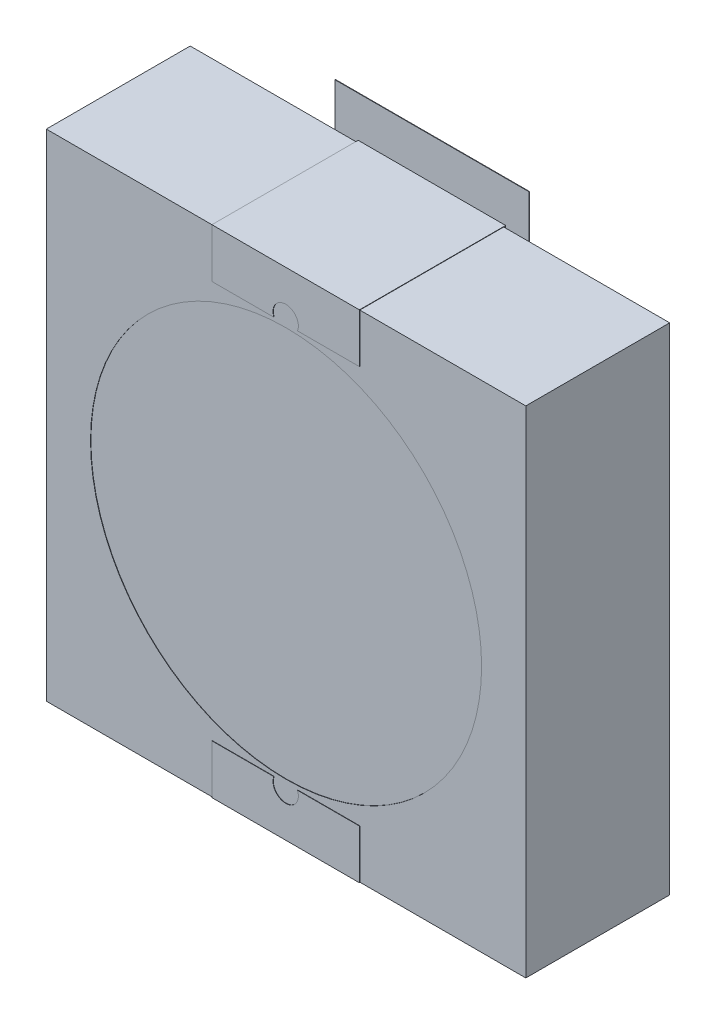
ISO-10303-21;
HEADER;
FILE_DESCRIPTION(('STEP AP214'),'2;1');
FILE_NAME('part.step','',(''),(''),'','','');
FILE_SCHEMA(('AUTOMOTIVE_DESIGN { 1 0 10303 214 1 1 1 1 }'));
ENDSEC;
DATA;
#1=APPLICATION_CONTEXT('core data for automotive mechanical design processes');
#2=APPLICATION_PROTOCOL_DEFINITION('international standard','automotive_design',2000,#1);
#3=PRODUCT_CONTEXT('',#1,'mechanical');
#4=PRODUCT('Part','Part','',(#3));
#5=PRODUCT_RELATED_PRODUCT_CATEGORY('part','',(#4));
#6=PRODUCT_DEFINITION_FORMATION('','',#4);
#7=PRODUCT_DEFINITION_CONTEXT('part definition',#1,'design');
#8=PRODUCT_DEFINITION('design','',#6,#7);
#9=PRODUCT_DEFINITION_SHAPE('','',#8);
#10=(LENGTH_UNIT() NAMED_UNIT(*) SI_UNIT(.MILLI.,.METRE.));
#11=(NAMED_UNIT(*) PLANE_ANGLE_UNIT() SI_UNIT($,.RADIAN.));
#12=(NAMED_UNIT(*) SI_UNIT($,.STERADIAN.) SOLID_ANGLE_UNIT());
#13=UNCERTAINTY_MEASURE_WITH_UNIT(LENGTH_MEASURE(1.E-05),#10,'distance_accuracy_value','');
#14=(GEOMETRIC_REPRESENTATION_CONTEXT(3) GLOBAL_UNCERTAINTY_ASSIGNED_CONTEXT((#13)) GLOBAL_UNIT_ASSIGNED_CONTEXT((#10,
#11,#12)) REPRESENTATION_CONTEXT('',''));
#15=CARTESIAN_POINT('',(0.,0.,0.));
#16=DIRECTION('',(0.,0.,1.));
#17=DIRECTION('',(1.,0.,0.));
#18=AXIS2_PLACEMENT_3D('',#15,#16,#17);
#19=CARTESIAN_POINT('',(-1.524,4.10972,0.0762));
#20=DIRECTION('',(0.,0.,-1.));
#21=DIRECTION('',(-1.,0.,0.));
#22=AXIS2_PLACEMENT_3D('',#19,#20,#21);
#23=PLANE('',#22);
#24=DIRECTION('',(1.,0.,0.));
#25=VECTOR('',#24,1.);
#26=CARTESIAN_POINT('',(2.0049998,-1.6500094,0.0762));
#27=LINE('',#26,#25);
#28=CARTESIAN_POINT('',(2.0049998,-1.6500094,0.0762));
#29=VERTEX_POINT('',#28);
#30=CARTESIAN_POINT('',(-2.0049998,-1.6500094,0.0762));
#31=VERTEX_POINT('',#30);
#32=EDGE_CURVE('E252',#29,#31,#27,.F.);
#33=ORIENTED_EDGE('',*,*,#32,.F.);
#34=DIRECTION('',(0.,1.,0.));
#35=VECTOR('',#34,1.);
#36=CARTESIAN_POINT('',(2.0049998,-5.9699906,0.0762));
#37=LINE('',#36,#35);
#38=CARTESIAN_POINT('',(2.0049998,-5.9699906,0.0762));
#39=VERTEX_POINT('',#38);
#40=EDGE_CURVE('E344',#39,#29,#37,.T.);
#41=ORIENTED_EDGE('',*,*,#40,.F.);
#42=DIRECTION('',(1.,0.,0.));
#43=VECTOR('',#42,1.);
#44=CARTESIAN_POINT('',(-2.0049998,-5.9699906,0.0762));
#45=LINE('',#44,#43);
#46=CARTESIAN_POINT('',(-2.0049998,-5.9699906,0.0762));
#47=VERTEX_POINT('',#46);
#48=EDGE_CURVE('E352',#47,#39,#45,.T.);
#49=ORIENTED_EDGE('',*,*,#48,.F.);
#50=DIRECTION('',(0.,1.,0.));
#51=VECTOR('',#50,1.);
#52=CARTESIAN_POINT('',(-2.0049998,-1.6500094,0.0762));
#53=LINE('',#52,#51);
#54=EDGE_CURVE('E357',#31,#47,#53,.F.);
#55=ORIENTED_EDGE('',*,*,#54,.F.);
#56=EDGE_LOOP('',(#33,#41,#49,#55));
#57=FACE_BOUND('',#56,.T.);
#58=ADVANCED_FACE('F16',(#57),#23,.T.);
#59=CARTESIAN_POINT('',(-1.524,4.10972,0.0762));
#60=DIRECTION('',(0.,0.,-1.));
#61=DIRECTION('',(-1.,0.,0.));
#62=AXIS2_PLACEMENT_3D('',#59,#60,#61);
#63=PLANE('',#62);
#64=DIRECTION('',(1.,0.,0.));
#65=VECTOR('',#64,1.);
#66=CARTESIAN_POINT('',(2.0049998,5.9699906,0.0762));
#67=LINE('',#66,#65);
#68=CARTESIAN_POINT('',(2.0049998,5.9699906,0.0762));
#69=VERTEX_POINT('',#68);
#70=CARTESIAN_POINT('',(-2.0049998,5.9699906,0.0762));
#71=VERTEX_POINT('',#70);
#72=EDGE_CURVE('E340',#69,#71,#67,.F.);
#73=ORIENTED_EDGE('',*,*,#72,.F.);
#74=DIRECTION('',(0.,1.,0.));
#75=VECTOR('',#74,1.);
#76=CARTESIAN_POINT('',(2.0049998,1.6500094,0.0762));
#77=LINE('',#76,#75);
#78=CARTESIAN_POINT('',(2.0049998,1.6500094,0.0762));
#79=VERTEX_POINT('',#78);
#80=EDGE_CURVE('E294',#79,#69,#77,.T.);
#81=ORIENTED_EDGE('',*,*,#80,.F.);
#82=DIRECTION('',(1.,0.,0.));
#83=VECTOR('',#82,1.);
#84=CARTESIAN_POINT('',(-2.0049998,1.6500094,0.0762));
#85=LINE('',#84,#83);
#86=CARTESIAN_POINT('',(-2.0049998,1.6500094,0.0762));
#87=VERTEX_POINT('',#86);
#88=EDGE_CURVE('E433',#87,#79,#85,.T.);
#89=ORIENTED_EDGE('',*,*,#88,.F.);
#90=DIRECTION('',(0.,1.,0.));
#91=VECTOR('',#90,1.);
#92=CARTESIAN_POINT('',(-2.0049998,5.9699906,0.0762));
#93=LINE('',#92,#91);
#94=EDGE_CURVE('E438',#71,#87,#93,.F.);
#95=ORIENTED_EDGE('',*,*,#94,.F.);
#96=EDGE_LOOP('',(#73,#81,#89,#95));
#97=FACE_BOUND('',#96,.T.);
#98=ADVANCED_FACE('F451',(#97),#63,.T.);
#99=CARTESIAN_POINT('',(-1.524,5.12572,3.10642));
#100=DIRECTION('',(0.,0.,1.));
#101=DIRECTION('',(1.,0.,0.));
#102=AXIS2_PLACEMENT_3D('',#99,#100,#101);
#103=PLANE('',#102);
#104=DIRECTION('',(1.,0.,0.));
#105=VECTOR('',#104,1.);
#106=CARTESIAN_POINT('',(-1.524,4.10972,3.10642));
#107=LINE('',#106,#105);
#108=CARTESIAN_POINT('',(-1.524,4.10972,3.10642));
#109=VERTEX_POINT('',#108);
#110=CARTESIAN_POINT('',(-0.244157293562977,4.10972,3.10642));
#111=VERTEX_POINT('',#110);
#112=EDGE_CURVE('E221',#109,#111,#107,.T.);
#113=ORIENTED_EDGE('',*,*,#112,.T.);
#114=CARTESIAN_POINT('',(0.,4.2037,3.10642));
#115=DIRECTION('',(0.,0.,1.));
#116=DIRECTION('',(1.,0.,0.));
#117=AXIS2_PLACEMENT_3D('',#114,#115,#116);
#118=CIRCLE('',#117,0.26162);
#119=CARTESIAN_POINT('',(0.244157293562981,4.10972,3.10642));
#120=VERTEX_POINT('',#119);
#121=EDGE_CURVE('E19',#111,#120,#118,.F.);
#122=ORIENTED_EDGE('',*,*,#121,.T.);
#123=DIRECTION('',(1.,0.,0.));
#124=VECTOR('',#123,1.);
#125=CARTESIAN_POINT('',(-1.524,4.10972,3.10642));
#126=LINE('',#125,#124);
#127=CARTESIAN_POINT('',(1.524,4.10972,3.10642));
#128=VERTEX_POINT('',#127);
#129=EDGE_CURVE('E264',#120,#128,#126,.T.);
#130=ORIENTED_EDGE('',*,*,#129,.T.);
#131=DIRECTION('',(0.,1.,0.));
#132=VECTOR('',#131,1.);
#133=CARTESIAN_POINT('',(1.524,5.12572,3.10642));
#134=LINE('',#133,#132);
#135=CARTESIAN_POINT('',(1.524,5.12572,3.10642));
#136=VERTEX_POINT('',#135);
#137=EDGE_CURVE('E266',#128,#136,#134,.T.);
#138=ORIENTED_EDGE('',*,*,#137,.T.);
#139=DIRECTION('',(1.,0.,0.));
#140=VECTOR('',#139,1.);
#141=CARTESIAN_POINT('',(-1.524,5.12572,3.10642));
#142=LINE('',#141,#140);
#143=CARTESIAN_POINT('',(-1.524,5.12572,3.10642));
#144=VERTEX_POINT('',#143);
#145=EDGE_CURVE('E291',#144,#136,#142,.T.);
#146=ORIENTED_EDGE('',*,*,#145,.F.);
#147=DIRECTION('',(0.,1.,0.));
#148=VECTOR('',#147,1.);
#149=CARTESIAN_POINT('',(-1.524,5.12572,3.10642));
#150=LINE('',#149,#148);
#151=EDGE_CURVE('E227',#144,#109,#150,.F.);
#152=ORIENTED_EDGE('',*,*,#151,.T.);
#153=EDGE_LOOP('',(#113,#122,#130,#138,#146,#152));
#154=FACE_BOUND('',#153,.T.);
#155=ADVANCED_FACE('F223',(#154),#103,.T.);
#156=CARTESIAN_POINT('',(0.,0.,3.09118));
#157=DIRECTION('',(0.,0.,1.));
#158=DIRECTION('',(1.,0.,0.));
#159=AXIS2_PLACEMENT_3D('',#156,#157,#158);
#160=PLANE('',#159);
#161=CARTESIAN_POINT('',(0.,0.,3.09118));
#162=DIRECTION('',(0.,0.,1.));
#163=DIRECTION('',(1.,0.,0.));
#164=AXIS2_PLACEMENT_3D('',#161,#162,#163);
#165=CIRCLE('',#164,4.0397019473008);
#166=CARTESIAN_POINT('',(4.0397019473008,0.,3.09118));
#167=VERTEX_POINT('',#166);
#168=EDGE_CURVE('E324',#167,#167,#165,.T.);
#169=ORIENTED_EDGE('',*,*,#168,.T.);
#170=EDGE_LOOP('',(#169));
#171=FACE_BOUND('',#170,.T.);
#172=ADVANCED_FACE('F733',(#171),#160,.T.);
#173=CARTESIAN_POINT('',(-1.524,-4.10972,3.10642));
#174=DIRECTION('',(0.,0.,1.));
#175=DIRECTION('',(1.,0.,0.));
#176=AXIS2_PLACEMENT_3D('',#173,#174,#175);
#177=PLANE('',#176);
#178=DIRECTION('',(1.,0.,0.));
#179=VECTOR('',#178,1.);
#180=CARTESIAN_POINT('',(-1.524,-4.10972,3.10642));
#181=LINE('',#180,#179);
#182=CARTESIAN_POINT('',(0.244157293562977,-4.10972,3.10642));
#183=VERTEX_POINT('',#182);
#184=CARTESIAN_POINT('',(1.524,-4.10972,3.10642));
#185=VERTEX_POINT('',#184);
#186=EDGE_CURVE('E329',#183,#185,#181,.T.);
#187=ORIENTED_EDGE('',*,*,#186,.F.);
#188=CARTESIAN_POINT('',(0.,-4.2037,3.10642));
#189=DIRECTION('',(0.,0.,1.));
#190=DIRECTION('',(1.,0.,0.));
#191=AXIS2_PLACEMENT_3D('',#188,#189,#190);
#192=CIRCLE('',#191,0.26162);
#193=CARTESIAN_POINT('',(-0.244157293562977,-4.10972,3.10642));
#194=VERTEX_POINT('',#193);
#195=EDGE_CURVE('E239',#183,#194,#192,.F.);
#196=ORIENTED_EDGE('',*,*,#195,.T.);
#197=DIRECTION('',(1.,0.,0.));
#198=VECTOR('',#197,1.);
#199=CARTESIAN_POINT('',(-1.524,-4.10972,3.10642));
#200=LINE('',#199,#198);
#201=CARTESIAN_POINT('',(-1.524,-4.10972,3.10642));
#202=VERTEX_POINT('',#201);
#203=EDGE_CURVE('E326',#202,#194,#200,.T.);
#204=ORIENTED_EDGE('',*,*,#203,.F.);
#205=DIRECTION('',(0.,1.,0.));
#206=VECTOR('',#205,1.);
#207=CARTESIAN_POINT('',(-1.524,-4.10972,3.10642));
#208=LINE('',#207,#206);
#209=CARTESIAN_POINT('',(-1.524,-5.12572,3.10642));
#210=VERTEX_POINT('',#209);
#211=EDGE_CURVE('E245',#202,#210,#208,.F.);
#212=ORIENTED_EDGE('',*,*,#211,.T.);
#213=DIRECTION('',(1.,0.,0.));
#214=VECTOR('',#213,1.);
#215=CARTESIAN_POINT('',(-1.524,-5.12572,3.10642));
#216=LINE('',#215,#214);
#217=CARTESIAN_POINT('',(1.524,-5.12572,3.10642));
#218=VERTEX_POINT('',#217);
#219=EDGE_CURVE('E269',#218,#210,#216,.F.);
#220=ORIENTED_EDGE('',*,*,#219,.F.);
#221=DIRECTION('',(0.,1.,0.));
#222=VECTOR('',#221,1.);
#223=CARTESIAN_POINT('',(1.524,-4.10972,3.10642));
#224=LINE('',#223,#222);
#225=EDGE_CURVE('E246',#218,#185,#224,.T.);
#226=ORIENTED_EDGE('',*,*,#225,.T.);
#227=EDGE_LOOP('',(#187,#196,#204,#212,#220,#226));
#228=FACE_BOUND('',#227,.T.);
#229=ADVANCED_FACE('F681',(#228),#177,.T.);
#230=CARTESIAN_POINT('',(2.0049998,-1.6500094,0.0762));
#231=DIRECTION('',(0.,1.,0.));
#232=DIRECTION('',(0.,0.,1.));
#233=AXIS2_PLACEMENT_3D('',#230,#231,#232);
#234=PLANE('',#233);
#235=DIRECTION('',(0.,0.,-1.));
#236=VECTOR('',#235,1.);
#237=CARTESIAN_POINT('',(2.0049998,-1.6500094,0.0762));
#238=LINE('',#237,#236);
#239=CARTESIAN_POINT('',(2.0049998,-1.6500094,0.08619999999996));
#240=VERTEX_POINT('',#239);
#241=EDGE_CURVE('E350',#29,#240,#238,.F.);
#242=ORIENTED_EDGE('',*,*,#241,.F.);
#243=ORIENTED_EDGE('',*,*,#32,.T.);
#244=DIRECTION('',(0.,0.,1.));
#245=VECTOR('',#244,1.);
#246=CARTESIAN_POINT('',(-2.0049998,-1.6500094,0.0762));
#247=LINE('',#246,#245);
#248=CARTESIAN_POINT('',(-2.0049998,-1.6500094,0.08619999999996));
#249=VERTEX_POINT('',#248);
#250=EDGE_CURVE('E359',#249,#31,#247,.F.);
#251=ORIENTED_EDGE('',*,*,#250,.F.);
#252=DIRECTION('',(1.,0.,0.));
#253=VECTOR('',#252,1.);
#254=CARTESIAN_POINT('',(0.,-1.6500094,0.08619999999996));
#255=LINE('',#254,#253);
#256=EDGE_CURVE('E271',#240,#249,#255,.F.);
#257=ORIENTED_EDGE('',*,*,#256,.F.);
#258=EDGE_LOOP('',(#242,#243,#251,#257));
#259=FACE_BOUND('',#258,.T.);
#260=ADVANCED_FACE('F726',(#259),#234,.T.);
#261=CARTESIAN_POINT('',(-2.0049998,-1.6500094,0.0762));
#262=DIRECTION('',(-1.,0.,0.));
#263=DIRECTION('',(0.,0.,1.));
#264=AXIS2_PLACEMENT_3D('',#261,#262,#263);
#265=PLANE('',#264);
#266=ORIENTED_EDGE('',*,*,#250,.T.);
#267=ORIENTED_EDGE('',*,*,#54,.T.);
#268=DIRECTION('',(0.,0.,-1.));
#269=VECTOR('',#268,1.);
#270=CARTESIAN_POINT('',(-2.0049998,-5.9699906,0.0762));
#271=LINE('',#270,#269);
#272=CARTESIAN_POINT('',(-2.0049998,-5.9699906,0.08619999999996));
#273=VERTEX_POINT('',#272);
#274=EDGE_CURVE('E354',#273,#47,#271,.T.);
#275=ORIENTED_EDGE('',*,*,#274,.F.);
#276=DIRECTION('',(0.,1.,0.));
#277=VECTOR('',#276,1.);
#278=CARTESIAN_POINT('',(-2.0049998,0.,0.08619999999996));
#279=LINE('',#278,#277);
#280=EDGE_CURVE('E485',#249,#273,#279,.F.);
#281=ORIENTED_EDGE('',*,*,#280,.F.);
#282=EDGE_LOOP('',(#266,#267,#275,#281));
#283=FACE_BOUND('',#282,.T.);
#284=ADVANCED_FACE('F722',(#283),#265,.T.);
#285=CARTESIAN_POINT('',(-2.0049998,-5.9699906,0.0762));
#286=DIRECTION('',(0.,-1.,0.));
#287=DIRECTION('',(0.,0.,-1.));
#288=AXIS2_PLACEMENT_3D('',#285,#286,#287);
#289=PLANE('',#288);
#290=ORIENTED_EDGE('',*,*,#274,.T.);
#291=ORIENTED_EDGE('',*,*,#48,.T.);
#292=DIRECTION('',(0.,0.,-1.));
#293=VECTOR('',#292,1.);
#294=CARTESIAN_POINT('',(2.0049998,-5.9699906,0.0762));
#295=LINE('',#294,#293);
#296=CARTESIAN_POINT('',(2.0049998,-5.9699906,0.08619999999996));
#297=VERTEX_POINT('',#296);
#298=EDGE_CURVE('E347',#297,#39,#295,.T.);
#299=ORIENTED_EDGE('',*,*,#298,.F.);
#300=DIRECTION('',(1.,0.,0.));
#301=VECTOR('',#300,1.);
#302=CARTESIAN_POINT('',(0.,-5.9699906,0.08619999999996));
#303=LINE('',#302,#301);
#304=EDGE_CURVE('E483',#273,#297,#303,.T.);
#305=ORIENTED_EDGE('',*,*,#304,.F.);
#306=EDGE_LOOP('',(#290,#291,#299,#305));
#307=FACE_BOUND('',#306,.T.);
#308=ADVANCED_FACE('F718',(#307),#289,.T.);
#309=CARTESIAN_POINT('',(2.0049998,-5.9699906,0.0762));
#310=DIRECTION('',(1.,0.,0.));
#311=DIRECTION('',(0.,0.,-1.));
#312=AXIS2_PLACEMENT_3D('',#309,#310,#311);
#313=PLANE('',#312);
#314=ORIENTED_EDGE('',*,*,#298,.T.);
#315=ORIENTED_EDGE('',*,*,#40,.T.);
#316=ORIENTED_EDGE('',*,*,#241,.T.);
#317=DIRECTION('',(0.,1.,0.));
#318=VECTOR('',#317,1.);
#319=CARTESIAN_POINT('',(2.0049998,0.,0.08619999999996));
#320=LINE('',#319,#318);
#321=EDGE_CURVE('E480',#297,#240,#320,.T.);
#322=ORIENTED_EDGE('',*,*,#321,.F.);
#323=EDGE_LOOP('',(#314,#315,#316,#322));
#324=FACE_BOUND('',#323,.T.);
#325=ADVANCED_FACE('F715',(#324),#313,.T.);
#326=CARTESIAN_POINT('',(2.0049998,5.9699906,0.0762));
#327=DIRECTION('',(0.,1.,0.));
#328=DIRECTION('',(0.,0.,1.));
#329=AXIS2_PLACEMENT_3D('',#326,#327,#328);
#330=PLANE('',#329);
#331=DIRECTION('',(0.,0.,-1.));
#332=VECTOR('',#331,1.);
#333=CARTESIAN_POINT('',(2.0049998,5.9699906,0.0762));
#334=LINE('',#333,#332);
#335=CARTESIAN_POINT('',(2.0049998,5.9699906,0.08619999999996));
#336=VERTEX_POINT('',#335);
#337=EDGE_CURVE('E431',#69,#336,#334,.F.);
#338=ORIENTED_EDGE('',*,*,#337,.F.);
#339=ORIENTED_EDGE('',*,*,#72,.T.);
#340=DIRECTION('',(0.,0.,1.));
#341=VECTOR('',#340,1.);
#342=CARTESIAN_POINT('',(-2.0049998,5.9699906,0.0762));
#343=LINE('',#342,#341);
#344=CARTESIAN_POINT('',(-2.0049998,5.9699906,0.08619999999996));
#345=VERTEX_POINT('',#344);
#346=EDGE_CURVE('E439',#345,#71,#343,.F.);
#347=ORIENTED_EDGE('',*,*,#346,.F.);
#348=DIRECTION('',(1.,0.,0.));
#349=VECTOR('',#348,1.);
#350=CARTESIAN_POINT('',(0.,5.9699906,0.08619999999996));
#351=LINE('',#350,#349);
#352=EDGE_CURVE('E467',#336,#345,#351,.F.);
#353=ORIENTED_EDGE('',*,*,#352,.F.);
#354=EDGE_LOOP('',(#338,#339,#347,#353));
#355=FACE_BOUND('',#354,.T.);
#356=ADVANCED_FACE('F447',(#355),#330,.T.);
#357=CARTESIAN_POINT('',(-2.0049998,5.9699906,0.0762));
#358=DIRECTION('',(-1.,0.,0.));
#359=DIRECTION('',(0.,0.,1.));
#360=AXIS2_PLACEMENT_3D('',#357,#358,#359);
#361=PLANE('',#360);
#362=ORIENTED_EDGE('',*,*,#346,.T.);
#363=ORIENTED_EDGE('',*,*,#94,.T.);
#364=DIRECTION('',(0.,0.,-1.));
#365=VECTOR('',#364,1.);
#366=CARTESIAN_POINT('',(-2.0049998,1.6500094,0.0762));
#367=LINE('',#366,#365);
#368=CARTESIAN_POINT('',(-2.0049998,1.6500094,0.08619999999996));
#369=VERTEX_POINT('',#368);
#370=EDGE_CURVE('E435',#369,#87,#367,.T.);
#371=ORIENTED_EDGE('',*,*,#370,.F.);
#372=DIRECTION('',(0.,1.,0.));
#373=VECTOR('',#372,1.);
#374=CARTESIAN_POINT('',(-2.0049998,0.,0.08619999999996));
#375=LINE('',#374,#373);
#376=EDGE_CURVE('E465',#345,#369,#375,.F.);
#377=ORIENTED_EDGE('',*,*,#376,.F.);
#378=EDGE_LOOP('',(#362,#363,#371,#377));
#379=FACE_BOUND('',#378,.T.);
#380=ADVANCED_FACE('F464',(#379),#361,.T.);
#381=CARTESIAN_POINT('',(-2.0049998,1.6500094,0.0762));
#382=DIRECTION('',(0.,-1.,0.));
#383=DIRECTION('',(0.,0.,-1.));
#384=AXIS2_PLACEMENT_3D('',#381,#382,#383);
#385=PLANE('',#384);
#386=ORIENTED_EDGE('',*,*,#370,.T.);
#387=ORIENTED_EDGE('',*,*,#88,.T.);
#388=DIRECTION('',(0.,0.,-1.));
#389=VECTOR('',#388,1.);
#390=CARTESIAN_POINT('',(2.0049998,1.6500094,0.0762));
#391=LINE('',#390,#389);
#392=CARTESIAN_POINT('',(2.0049998,1.6500094,0.08619999999996));
#393=VERTEX_POINT('',#392);
#394=EDGE_CURVE('E428',#393,#79,#391,.T.);
#395=ORIENTED_EDGE('',*,*,#394,.F.);
#396=DIRECTION('',(1.,0.,0.));
#397=VECTOR('',#396,1.);
#398=CARTESIAN_POINT('',(0.,1.6500094,0.08619999999996));
#399=LINE('',#398,#397);
#400=EDGE_CURVE('E462',#369,#393,#399,.T.);
#401=ORIENTED_EDGE('',*,*,#400,.F.);
#402=EDGE_LOOP('',(#386,#387,#395,#401));
#403=FACE_BOUND('',#402,.T.);
#404=ADVANCED_FACE('F461',(#403),#385,.T.);
#405=CARTESIAN_POINT('',(2.0049998,1.6500094,0.0762));
#406=DIRECTION('',(1.,0.,0.));
#407=DIRECTION('',(0.,0.,-1.));
#408=AXIS2_PLACEMENT_3D('',#405,#406,#407);
#409=PLANE('',#408);
#410=ORIENTED_EDGE('',*,*,#394,.T.);
#411=ORIENTED_EDGE('',*,*,#80,.T.);
#412=ORIENTED_EDGE('',*,*,#337,.T.);
#413=DIRECTION('',(0.,1.,0.));
#414=VECTOR('',#413,1.);
#415=CARTESIAN_POINT('',(2.0049998,0.,0.08619999999996));
#416=LINE('',#415,#414);
#417=EDGE_CURVE('E458',#393,#336,#416,.T.);
#418=ORIENTED_EDGE('',*,*,#417,.F.);
#419=EDGE_LOOP('',(#410,#411,#412,#418));
#420=FACE_BOUND('',#419,.T.);
#421=ADVANCED_FACE('F454',(#420),#409,.T.);
#422=CARTESIAN_POINT('',(-1.524,5.12572,0.0762));
#423=DIRECTION('',(0.,1.,0.));
#424=DIRECTION('',(0.,0.,1.));
#425=AXIS2_PLACEMENT_3D('',#422,#423,#424);
#426=PLANE('',#425);
#427=DIRECTION('',(0.,0.,-1.));
#428=VECTOR('',#427,1.);
#429=CARTESIAN_POINT('',(1.524,5.12572,0.0762));
#430=LINE('',#429,#428);
#431=CARTESIAN_POINT('',(1.524,5.12572,0.08619999999996));
#432=VERTEX_POINT('',#431);
#433=EDGE_CURVE('E307',#432,#136,#430,.F.);
#434=ORIENTED_EDGE('',*,*,#433,.F.);
#435=DIRECTION('',(1.,0.,0.));
#436=VECTOR('',#435,1.);
#437=CARTESIAN_POINT('',(0.,5.12572,0.08619999999996));
#438=LINE('',#437,#436);
#439=CARTESIAN_POINT('',(-1.524,5.12572,0.08619999999996));
#440=VERTEX_POINT('',#439);
#441=EDGE_CURVE('E505',#440,#432,#438,.T.);
#442=ORIENTED_EDGE('',*,*,#441,.F.);
#443=DIRECTION('',(0.,0.,-1.));
#444=VECTOR('',#443,1.);
#445=CARTESIAN_POINT('',(-1.524,5.12572,0.0762));
#446=LINE('',#445,#444);
#447=EDGE_CURVE('E297',#440,#144,#446,.F.);
#448=ORIENTED_EDGE('',*,*,#447,.T.);
#449=ORIENTED_EDGE('',*,*,#145,.T.);
#450=EDGE_LOOP('',(#434,#442,#448,#449));
#451=FACE_BOUND('',#450,.T.);
#452=ADVANCED_FACE('F596',(#451),#426,.T.);
#453=CARTESIAN_POINT('',(-1.524,4.10972,3.10642));
#454=DIRECTION('',(0.,-1.,0.));
#455=DIRECTION('',(0.,0.,-1.));
#456=AXIS2_PLACEMENT_3D('',#453,#454,#455);
#457=PLANE('',#456);
#458=ORIENTED_EDGE('',*,*,#129,.F.);
#459=DIRECTION('',(0.,0.,1.));
#460=VECTOR('',#459,1.);
#461=CARTESIAN_POINT('',(0.24415729356298,4.10972,3.0988));
#462=LINE('',#461,#460);
#463=CARTESIAN_POINT('',(0.244157293562981,4.10972,3.0988));
#464=VERTEX_POINT('',#463);
#465=EDGE_CURVE('E240',#120,#464,#462,.F.);
#466=ORIENTED_EDGE('',*,*,#465,.T.);
#467=DIRECTION('',(1.,0.,0.));
#468=VECTOR('',#467,1.);
#469=CARTESIAN_POINT('',(0.,4.10972,3.0988));
#470=LINE('',#469,#468);
#471=CARTESIAN_POINT('',(1.524,4.10972,3.0988));
#472=VERTEX_POINT('',#471);
#473=EDGE_CURVE('E323',#472,#464,#470,.F.);
#474=ORIENTED_EDGE('',*,*,#473,.F.);
#475=DIRECTION('',(0.,0.,-1.));
#476=VECTOR('',#475,1.);
#477=CARTESIAN_POINT('',(1.524,4.10972,0.0762));
#478=LINE('',#477,#476);
#479=EDGE_CURVE('E310',#128,#472,#478,.T.);
#480=ORIENTED_EDGE('',*,*,#479,.F.);
#481=EDGE_LOOP('',(#458,#466,#474,#480));
#482=FACE_BOUND('',#481,.T.);
#483=ADVANCED_FACE('F592',(#482),#457,.T.);
#484=CARTESIAN_POINT('',(0.,4.2037,3.0988));
#485=DIRECTION('',(0.,0.,1.));
#486=DIRECTION('',(1.,0.,0.));
#487=AXIS2_PLACEMENT_3D('',#484,#485,#486);
#488=CYLINDRICAL_SURFACE('',#487,0.26162);
#489=CARTESIAN_POINT('',(0.,4.2037,3.0988));
#490=DIRECTION('',(0.,0.,1.));
#491=DIRECTION('',(1.,0.,0.));
#492=AXIS2_PLACEMENT_3D('',#489,#490,#491);
#493=CIRCLE('',#492,0.26162);
#494=CARTESIAN_POINT('',(-0.244157293562977,4.10972,3.0988));
#495=VERTEX_POINT('',#494);
#496=EDGE_CURVE('E321',#464,#495,#493,.T.);
#497=ORIENTED_EDGE('',*,*,#496,.F.);
#498=ORIENTED_EDGE('',*,*,#465,.F.);
#499=ORIENTED_EDGE('',*,*,#121,.F.);
#500=DIRECTION('',(0.,0.,-1.));
#501=VECTOR('',#500,1.);
#502=CARTESIAN_POINT('',(-0.244157293562973,4.10972,3.10642));
#503=LINE('',#502,#501);
#504=EDGE_CURVE('E234',#495,#111,#503,.F.);
#505=ORIENTED_EDGE('',*,*,#504,.F.);
#506=EDGE_LOOP('',(#497,#498,#499,#505));
#507=FACE_BOUND('',#506,.T.);
#508=ADVANCED_FACE('F242',(#507),#488,.F.);
#509=CARTESIAN_POINT('',(-1.524,4.10972,3.10642));
#510=DIRECTION('',(0.,-1.,0.));
#511=DIRECTION('',(0.,0.,-1.));
#512=AXIS2_PLACEMENT_3D('',#509,#510,#511);
#513=PLANE('',#512);
#514=DIRECTION('',(1.,0.,0.));
#515=VECTOR('',#514,1.);
#516=CARTESIAN_POINT('',(0.,4.10972,3.0988));
#517=LINE('',#516,#515);
#518=CARTESIAN_POINT('',(-1.524,4.10972,3.0988));
#519=VERTEX_POINT('',#518);
#520=EDGE_CURVE('E236',#495,#519,#517,.F.);
#521=ORIENTED_EDGE('',*,*,#520,.F.);
#522=ORIENTED_EDGE('',*,*,#504,.T.);
#523=ORIENTED_EDGE('',*,*,#112,.F.);
#524=DIRECTION('',(0.,0.,-1.));
#525=VECTOR('',#524,1.);
#526=CARTESIAN_POINT('',(-1.524,4.10972,0.0762));
#527=LINE('',#526,#525);
#528=EDGE_CURVE('E300',#109,#519,#527,.T.);
#529=ORIENTED_EDGE('',*,*,#528,.T.);
#530=EDGE_LOOP('',(#521,#522,#523,#529));
#531=FACE_BOUND('',#530,.T.);
#532=ADVANCED_FACE('F235',(#531),#513,.T.);
#533=CARTESIAN_POINT('',(0.,-4.2037,3.0988));
#534=DIRECTION('',(0.,0.,1.));
#535=DIRECTION('',(1.,0.,0.));
#536=AXIS2_PLACEMENT_3D('',#533,#534,#535);
#537=CYLINDRICAL_SURFACE('',#536,0.26162);
#538=CARTESIAN_POINT('',(0.,-4.2037,3.0988));
#539=DIRECTION('',(0.,0.,1.));
#540=DIRECTION('',(1.,0.,0.));
#541=AXIS2_PLACEMENT_3D('',#538,#539,#540);
#542=CIRCLE('',#541,0.26162);
#543=CARTESIAN_POINT('',(-0.244157293562977,-4.10972,3.0988));
#544=VERTEX_POINT('',#543);
#545=CARTESIAN_POINT('',(0.244157293562977,-4.10972,3.0988));
#546=VERTEX_POINT('',#545);
#547=EDGE_CURVE('E318',#544,#546,#542,.T.);
#548=ORIENTED_EDGE('',*,*,#547,.F.);
#549=DIRECTION('',(0.,0.,1.));
#550=VECTOR('',#549,1.);
#551=CARTESIAN_POINT('',(-0.244157293562973,-4.10972,0.0762));
#552=LINE('',#551,#550);
#553=EDGE_CURVE('E272',#194,#544,#552,.F.);
#554=ORIENTED_EDGE('',*,*,#553,.F.);
#555=ORIENTED_EDGE('',*,*,#195,.F.);
#556=DIRECTION('',(0.,0.,1.));
#557=VECTOR('',#556,1.);
#558=CARTESIAN_POINT('',(0.244157293562973,-4.10972,0.0762));
#559=LINE('',#558,#557);
#560=EDGE_CURVE('E327',#546,#183,#559,.T.);
#561=ORIENTED_EDGE('',*,*,#560,.F.);
#562=EDGE_LOOP('',(#548,#554,#555,#561));
#563=FACE_BOUND('',#562,.T.);
#564=ADVANCED_FACE('F575',(#563),#537,.F.);
#565=CARTESIAN_POINT('',(-1.524,-4.10972,0.0762));
#566=DIRECTION('',(0.,1.,0.));
#567=DIRECTION('',(0.,0.,1.));
#568=AXIS2_PLACEMENT_3D('',#565,#566,#567);
#569=PLANE('',#568);
#570=DIRECTION('',(1.,0.,0.));
#571=VECTOR('',#570,1.);
#572=CARTESIAN_POINT('',(0.,-4.10972,3.0988));
#573=LINE('',#572,#571);
#574=CARTESIAN_POINT('',(1.524,-4.10972,3.0988));
#575=VERTEX_POINT('',#574);
#576=EDGE_CURVE('E317',#546,#575,#573,.T.);
#577=ORIENTED_EDGE('',*,*,#576,.F.);
#578=ORIENTED_EDGE('',*,*,#560,.T.);
#579=ORIENTED_EDGE('',*,*,#186,.T.);
#580=DIRECTION('',(0.,0.,-1.));
#581=VECTOR('',#580,1.);
#582=CARTESIAN_POINT('',(1.524,-4.10972,0.0762));
#583=LINE('',#582,#581);
#584=EDGE_CURVE('E278',#575,#185,#583,.F.);
#585=ORIENTED_EDGE('',*,*,#584,.F.);
#586=EDGE_LOOP('',(#577,#578,#579,#585));
#587=FACE_BOUND('',#586,.T.);
#588=ADVANCED_FACE('F576',(#587),#569,.T.);
#589=CARTESIAN_POINT('',(0.,0.,3.0988));
#590=DIRECTION('',(0.,0.,1.));
#591=DIRECTION('',(1.,0.,0.));
#592=AXIS2_PLACEMENT_3D('',#589,#590,#591);
#593=CYLINDRICAL_SURFACE('',#592,4.0397019473008);
#594=ORIENTED_EDGE('',*,*,#168,.F.);
#595=EDGE_LOOP('',(#594));
#596=FACE_BOUND('',#595,.T.);
#597=CARTESIAN_POINT('',(0.,0.,3.0988));
#598=DIRECTION('',(0.,0.,1.));
#599=DIRECTION('',(1.,0.,0.));
#600=AXIS2_PLACEMENT_3D('',#597,#598,#599);
#601=CIRCLE('',#600,4.0397019473008);
#602=CARTESIAN_POINT('',(4.0397019473008,0.,3.0988));
#603=VERTEX_POINT('',#602);
#604=EDGE_CURVE('E313',#603,#603,#601,.F.);
#605=ORIENTED_EDGE('',*,*,#604,.F.);
#606=EDGE_LOOP('',(#605));
#607=FACE_BOUND('',#606,.T.);
#608=ADVANCED_FACE('F684',(#596,#607),#593,.F.);
#609=CARTESIAN_POINT('',(-1.524,-4.10972,0.0762));
#610=DIRECTION('',(0.,1.,0.));
#611=DIRECTION('',(0.,0.,1.));
#612=AXIS2_PLACEMENT_3D('',#609,#610,#611);
#613=PLANE('',#612);
#614=ORIENTED_EDGE('',*,*,#203,.T.);
#615=ORIENTED_EDGE('',*,*,#553,.T.);
#616=DIRECTION('',(1.,0.,0.));
#617=VECTOR('',#616,1.);
#618=CARTESIAN_POINT('',(0.,-4.10972,3.0988));
#619=LINE('',#618,#617);
#620=CARTESIAN_POINT('',(-1.524,-4.10972,3.0988));
#621=VERTEX_POINT('',#620);
#622=EDGE_CURVE('E320',#621,#544,#619,.T.);
#623=ORIENTED_EDGE('',*,*,#622,.F.);
#624=DIRECTION('',(0.,0.,-1.));
#625=VECTOR('',#624,1.);
#626=CARTESIAN_POINT('',(-1.524,-4.10972,0.0762));
#627=LINE('',#626,#625);
#628=EDGE_CURVE('E285',#621,#202,#627,.F.);
#629=ORIENTED_EDGE('',*,*,#628,.T.);
#630=EDGE_LOOP('',(#614,#615,#623,#629));
#631=FACE_BOUND('',#630,.T.);
#632=ADVANCED_FACE('F682',(#631),#613,.T.);
#633=CARTESIAN_POINT('',(-1.524,-5.12572,3.10642));
#634=DIRECTION('',(0.,-1.,0.));
#635=DIRECTION('',(0.,0.,-1.));
#636=AXIS2_PLACEMENT_3D('',#633,#634,#635);
#637=PLANE('',#636);
#638=DIRECTION('',(0.,0.,-1.));
#639=VECTOR('',#638,1.);
#640=CARTESIAN_POINT('',(-1.524,-5.12572,0.0762));
#641=LINE('',#640,#639);
#642=CARTESIAN_POINT('',(-1.524,-5.12572,0.08619999999996));
#643=VERTEX_POINT('',#642);
#644=EDGE_CURVE('E281',#210,#643,#641,.T.);
#645=ORIENTED_EDGE('',*,*,#644,.T.);
#646=DIRECTION('',(1.,0.,0.));
#647=VECTOR('',#646,1.);
#648=CARTESIAN_POINT('',(0.,-5.12572,0.08619999999996));
#649=LINE('',#648,#647);
#650=CARTESIAN_POINT('',(1.524,-5.12572,0.08619999999996));
#651=VERTEX_POINT('',#650);
#652=EDGE_CURVE('E478',#651,#643,#649,.F.);
#653=ORIENTED_EDGE('',*,*,#652,.F.);
#654=DIRECTION('',(0.,0.,-1.));
#655=VECTOR('',#654,1.);
#656=CARTESIAN_POINT('',(1.524,-5.12572,0.0762));
#657=LINE('',#656,#655);
#658=EDGE_CURVE('E275',#218,#651,#657,.T.);
#659=ORIENTED_EDGE('',*,*,#658,.F.);
#660=ORIENTED_EDGE('',*,*,#219,.T.);
#661=EDGE_LOOP('',(#645,#653,#659,#660));
#662=FACE_BOUND('',#661,.T.);
#663=ADVANCED_FACE('F680',(#662),#637,.T.);
#664=CARTESIAN_POINT('',(0.,0.,0.08619999999996));
#665=DIRECTION('',(0.,0.,1.));
#666=DIRECTION('',(1.,0.,0.));
#667=AXIS2_PLACEMENT_3D('',#664,#665,#666);
#668=PLANE('',#667);
#669=ORIENTED_EDGE('',*,*,#652,.T.);
#670=DIRECTION('',(0.,1.,0.));
#671=VECTOR('',#670,1.);
#672=CARTESIAN_POINT('',(-1.524,0.,0.08619999999996));
#673=LINE('',#672,#671);
#674=CARTESIAN_POINT('',(-1.524,-4.10972,0.08619999999996));
#675=VERTEX_POINT('',#674);
#676=EDGE_CURVE('E316',#643,#675,#673,.T.);
#677=ORIENTED_EDGE('',*,*,#676,.T.);
#678=DIRECTION('',(1.,0.,0.));
#679=VECTOR('',#678,1.);
#680=CARTESIAN_POINT('',(-1.524,-4.10972,0.08619999999996));
#681=LINE('',#680,#679);
#682=CARTESIAN_POINT('',(1.524,-4.10972,0.08619999999996));
#683=VERTEX_POINT('',#682);
#684=EDGE_CURVE('E418',#683,#675,#681,.F.);
#685=ORIENTED_EDGE('',*,*,#684,.F.);
#686=DIRECTION('',(0.,1.,0.));
#687=VECTOR('',#686,1.);
#688=CARTESIAN_POINT('',(1.524,0.,0.08619999999996));
#689=LINE('',#688,#687);
#690=EDGE_CURVE('E277',#651,#683,#689,.T.);
#691=ORIENTED_EDGE('',*,*,#690,.F.);
#692=EDGE_LOOP('',(#669,#677,#685,#691));
#693=FACE_BOUND('',#692,.T.);
#694=ORIENTED_EDGE('',*,*,#304,.T.);
#695=ORIENTED_EDGE('',*,*,#321,.T.);
#696=ORIENTED_EDGE('',*,*,#256,.T.);
#697=ORIENTED_EDGE('',*,*,#280,.T.);
#698=EDGE_LOOP('',(#694,#695,#696,#697));
#699=FACE_BOUND('',#698,.T.);
#700=ADVANCED_FACE('F626',(#693,#699),#668,.T.);
#701=CARTESIAN_POINT('',(1.524,0.,0.0762));
#702=DIRECTION('',(1.,0.,0.));
#703=DIRECTION('',(0.,0.,-1.));
#704=AXIS2_PLACEMENT_3D('',#701,#702,#703);
#705=PLANE('',#704);
#706=ORIENTED_EDGE('',*,*,#658,.T.);
#707=ORIENTED_EDGE('',*,*,#690,.T.);
#708=DIRECTION('',(0.,0.,1.));
#709=VECTOR('',#708,1.);
#710=CARTESIAN_POINT('',(1.524,-4.10972,0.0762));
#711=LINE('',#710,#709);
#712=CARTESIAN_POINT('',(1.524,-4.10972,0.126200000000003));
#713=VERTEX_POINT('',#712);
#714=EDGE_CURVE('E617',#713,#683,#711,.F.);
#715=ORIENTED_EDGE('',*,*,#714,.F.);
#716=DIRECTION('',(0.,1.,0.));
#717=VECTOR('',#716,1.);
#718=CARTESIAN_POINT('',(1.524,0.,0.126200000000003));
#719=LINE('',#718,#717);
#720=CARTESIAN_POINT('',(1.524,-5.1181,0.126200000000003));
#721=VERTEX_POINT('',#720);
#722=EDGE_CURVE('E411',#713,#721,#719,.F.);
#723=ORIENTED_EDGE('',*,*,#722,.T.);
#724=DIRECTION('',(0.,0.,-1.));
#725=VECTOR('',#724,1.);
#726=CARTESIAN_POINT('',(1.524,-5.1181,0.0762));
#727=LINE('',#726,#725);
#728=CARTESIAN_POINT('',(1.524,-5.1181,3.0988));
#729=VERTEX_POINT('',#728);
#730=EDGE_CURVE('E417',#729,#721,#727,.T.);
#731=ORIENTED_EDGE('',*,*,#730,.F.);
#732=DIRECTION('',(0.,1.,0.));
#733=VECTOR('',#732,1.);
#734=CARTESIAN_POINT('',(1.524,0.,3.0988));
#735=LINE('',#734,#733);
#736=EDGE_CURVE('E391',#575,#729,#735,.F.);
#737=ORIENTED_EDGE('',*,*,#736,.F.);
#738=ORIENTED_EDGE('',*,*,#584,.T.);
#739=ORIENTED_EDGE('',*,*,#225,.F.);
#740=EDGE_LOOP('',(#706,#707,#715,#723,#731,#737,#738,#739));
#741=FACE_BOUND('',#740,.T.);
#742=ADVANCED_FACE('F520',(#741),#705,.T.);
#743=CARTESIAN_POINT('',(1.524,0.,0.0762));
#744=DIRECTION('',(1.,0.,0.));
#745=DIRECTION('',(0.,0.,-1.));
#746=AXIS2_PLACEMENT_3D('',#743,#744,#745);
#747=PLANE('',#746);
#748=DIRECTION('',(0.,0.,-1.));
#749=VECTOR('',#748,1.);
#750=CARTESIAN_POINT('',(1.524,4.10972,0.0762));
#751=LINE('',#750,#749);
#752=CARTESIAN_POINT('',(1.524,4.10972,0.126200000000003));
#753=VERTEX_POINT('',#752);
#754=CARTESIAN_POINT('',(1.524,4.10972,0.08619999999996));
#755=VERTEX_POINT('',#754);
#756=EDGE_CURVE('E470',#753,#755,#751,.T.);
#757=ORIENTED_EDGE('',*,*,#756,.T.);
#758=DIRECTION('',(0.,1.,0.));
#759=VECTOR('',#758,1.);
#760=CARTESIAN_POINT('',(1.524,0.,0.08619999999996));
#761=LINE('',#760,#759);
#762=EDGE_CURVE('E502',#432,#755,#761,.F.);
#763=ORIENTED_EDGE('',*,*,#762,.F.);
#764=ORIENTED_EDGE('',*,*,#433,.T.);
#765=ORIENTED_EDGE('',*,*,#137,.F.);
#766=ORIENTED_EDGE('',*,*,#479,.T.);
#767=DIRECTION('',(0.,1.,0.));
#768=VECTOR('',#767,1.);
#769=CARTESIAN_POINT('',(1.524,0.,3.0988));
#770=LINE('',#769,#768);
#771=CARTESIAN_POINT('',(1.524,5.1181,3.0988));
#772=VERTEX_POINT('',#771);
#773=EDGE_CURVE('E388',#772,#472,#770,.F.);
#774=ORIENTED_EDGE('',*,*,#773,.F.);
#775=DIRECTION('',(0.,0.,1.));
#776=VECTOR('',#775,1.);
#777=CARTESIAN_POINT('',(1.524,5.1181,0.0762));
#778=LINE('',#777,#776);
#779=CARTESIAN_POINT('',(1.524,5.1181,0.126200000000003));
#780=VERTEX_POINT('',#779);
#781=EDGE_CURVE('E398',#780,#772,#778,.T.);
#782=ORIENTED_EDGE('',*,*,#781,.F.);
#783=DIRECTION('',(0.,1.,0.));
#784=VECTOR('',#783,1.);
#785=CARTESIAN_POINT('',(1.524,0.,0.126200000000003));
#786=LINE('',#785,#784);
#787=EDGE_CURVE('E395',#780,#753,#786,.F.);
#788=ORIENTED_EDGE('',*,*,#787,.T.);
#789=EDGE_LOOP('',(#757,#763,#764,#765,#766,#774,#782,#788));
#790=FACE_BOUND('',#789,.T.);
#791=ADVANCED_FACE('F509',(#790),#747,.T.);
#792=CARTESIAN_POINT('',(0.,0.,0.08619999999996));
#793=DIRECTION('',(0.,0.,1.));
#794=DIRECTION('',(1.,0.,0.));
#795=AXIS2_PLACEMENT_3D('',#792,#793,#794);
#796=PLANE('',#795);
#797=DIRECTION('',(1.,0.,0.));
#798=VECTOR('',#797,1.);
#799=CARTESIAN_POINT('',(-1.524,4.10972,0.0861999999999599));
#800=LINE('',#799,#798);
#801=CARTESIAN_POINT('',(-1.524,4.10972,0.08619999999996));
#802=VERTEX_POINT('',#801);
#803=EDGE_CURVE('E601',#802,#755,#800,.T.);
#804=ORIENTED_EDGE('',*,*,#803,.F.);
#805=DIRECTION('',(0.,1.,0.));
#806=VECTOR('',#805,1.);
#807=CARTESIAN_POINT('',(-1.524,0.,0.08619999999996));
#808=LINE('',#807,#806);
#809=EDGE_CURVE('E301',#802,#440,#808,.T.);
#810=ORIENTED_EDGE('',*,*,#809,.T.);
#811=ORIENTED_EDGE('',*,*,#441,.T.);
#812=ORIENTED_EDGE('',*,*,#762,.T.);
#813=EDGE_LOOP('',(#804,#810,#811,#812));
#814=FACE_BOUND('',#813,.T.);
#815=ORIENTED_EDGE('',*,*,#400,.T.);
#816=ORIENTED_EDGE('',*,*,#417,.T.);
#817=ORIENTED_EDGE('',*,*,#352,.T.);
#818=ORIENTED_EDGE('',*,*,#376,.T.);
#819=EDGE_LOOP('',(#815,#816,#817,#818));
#820=FACE_BOUND('',#819,.T.);
#821=ADVANCED_FACE('F506',(#814,#820),#796,.T.);
#822=CARTESIAN_POINT('',(-1.524,0.,0.0762));
#823=DIRECTION('',(1.,0.,0.));
#824=DIRECTION('',(0.,0.,-1.));
#825=AXIS2_PLACEMENT_3D('',#822,#823,#824);
#826=PLANE('',#825);
#827=DIRECTION('',(0.,1.,0.));
#828=VECTOR('',#827,1.);
#829=CARTESIAN_POINT('',(-1.524,0.,0.126200000000003));
#830=LINE('',#829,#828);
#831=CARTESIAN_POINT('',(-1.524,5.1181,0.126200000000003));
#832=VERTEX_POINT('',#831);
#833=CARTESIAN_POINT('',(-1.524,4.10972,0.126200000000003));
#834=VERTEX_POINT('',#833);
#835=EDGE_CURVE('E380',#832,#834,#830,.F.);
#836=ORIENTED_EDGE('',*,*,#835,.F.);
#837=DIRECTION('',(0.,0.,1.));
#838=VECTOR('',#837,1.);
#839=CARTESIAN_POINT('',(-1.524,5.1181,0.0762));
#840=LINE('',#839,#838);
#841=CARTESIAN_POINT('',(-1.524,5.1181,3.0988));
#842=VERTEX_POINT('',#841);
#843=EDGE_CURVE('E607',#842,#832,#840,.F.);
#844=ORIENTED_EDGE('',*,*,#843,.F.);
#845=DIRECTION('',(0.,1.,0.));
#846=VECTOR('',#845,1.);
#847=CARTESIAN_POINT('',(-1.524,0.,3.0988));
#848=LINE('',#847,#846);
#849=EDGE_CURVE('E383',#519,#842,#848,.T.);
#850=ORIENTED_EDGE('',*,*,#849,.F.);
#851=ORIENTED_EDGE('',*,*,#528,.F.);
#852=ORIENTED_EDGE('',*,*,#151,.F.);
#853=ORIENTED_EDGE('',*,*,#447,.F.);
#854=ORIENTED_EDGE('',*,*,#809,.F.);
#855=DIRECTION('',(0.,0.,-1.));
#856=VECTOR('',#855,1.);
#857=CARTESIAN_POINT('',(-1.524,4.10972,3.10642));
#858=LINE('',#857,#856);
#859=EDGE_CURVE('E401',#834,#802,#858,.T.);
#860=ORIENTED_EDGE('',*,*,#859,.F.);
#861=EDGE_LOOP('',(#836,#844,#850,#851,#852,#853,#854,#860));
#862=FACE_BOUND('',#861,.T.);
#863=ADVANCED_FACE('F508',(#862),#826,.F.);
#864=CARTESIAN_POINT('',(0.,0.,3.0988));
#865=DIRECTION('',(0.,0.,1.));
#866=DIRECTION('',(1.,0.,0.));
#867=AXIS2_PLACEMENT_3D('',#864,#865,#866);
#868=PLANE('',#867);
#869=ORIENTED_EDGE('',*,*,#604,.T.);
#870=EDGE_LOOP('',(#869));
#871=FACE_BOUND('',#870,.T.);
#872=ORIENTED_EDGE('',*,*,#547,.T.);
#873=ORIENTED_EDGE('',*,*,#576,.T.);
#874=ORIENTED_EDGE('',*,*,#736,.T.);
#875=DIRECTION('',(1.,0.,0.));
#876=VECTOR('',#875,1.);
#877=CARTESIAN_POINT('',(-4.953,-5.1181,3.0988));
#878=LINE('',#877,#876);
#879=CARTESIAN_POINT('',(4.953,-5.1181,3.0988));
#880=VERTEX_POINT('',#879);
#881=EDGE_CURVE('E414',#880,#729,#878,.F.);
#882=ORIENTED_EDGE('',*,*,#881,.F.);
#883=DIRECTION('',(0.,1.,0.));
#884=VECTOR('',#883,1.);
#885=CARTESIAN_POINT('',(4.953,-5.1181,3.0988));
#886=LINE('',#885,#884);
#887=CARTESIAN_POINT('',(4.953,5.1181,3.0988));
#888=VERTEX_POINT('',#887);
#889=EDGE_CURVE('E423',#888,#880,#886,.F.);
#890=ORIENTED_EDGE('',*,*,#889,.F.);
#891=DIRECTION('',(1.,0.,0.));
#892=VECTOR('',#891,1.);
#893=CARTESIAN_POINT('',(4.953,5.1181,3.0988));
#894=LINE('',#893,#892);
#895=EDGE_CURVE('E405',#772,#888,#894,.T.);
#896=ORIENTED_EDGE('',*,*,#895,.F.);
#897=ORIENTED_EDGE('',*,*,#773,.T.);
#898=ORIENTED_EDGE('',*,*,#473,.T.);
#899=ORIENTED_EDGE('',*,*,#496,.T.);
#900=ORIENTED_EDGE('',*,*,#520,.T.);
#901=ORIENTED_EDGE('',*,*,#849,.T.);
#902=DIRECTION('',(1.,0.,0.));
#903=VECTOR('',#902,1.);
#904=CARTESIAN_POINT('',(4.953,5.1181,3.0988));
#905=LINE('',#904,#903);
#906=CARTESIAN_POINT('',(-4.953,5.1181,3.0988));
#907=VERTEX_POINT('',#906);
#908=EDGE_CURVE('E604',#907,#842,#905,.T.);
#909=ORIENTED_EDGE('',*,*,#908,.F.);
#910=DIRECTION('',(0.,1.,0.));
#911=VECTOR('',#910,1.);
#912=CARTESIAN_POINT('',(-4.953,5.1181,3.0988));
#913=LINE('',#912,#911);
#914=CARTESIAN_POINT('',(-4.953,-5.1181,3.0988));
#915=VERTEX_POINT('',#914);
#916=EDGE_CURVE('E664',#915,#907,#913,.T.);
#917=ORIENTED_EDGE('',*,*,#916,.F.);
#918=DIRECTION('',(1.,0.,0.));
#919=VECTOR('',#918,1.);
#920=CARTESIAN_POINT('',(-4.953,-5.1181,3.0988));
#921=LINE('',#920,#919);
#922=CARTESIAN_POINT('',(-1.524,-5.1181,3.0988));
#923=VERTEX_POINT('',#922);
#924=EDGE_CURVE('E661',#923,#915,#921,.F.);
#925=ORIENTED_EDGE('',*,*,#924,.F.);
#926=DIRECTION('',(0.,1.,0.));
#927=VECTOR('',#926,1.);
#928=CARTESIAN_POINT('',(-1.524,0.,3.0988));
#929=LINE('',#928,#927);
#930=EDGE_CURVE('E371',#923,#621,#929,.T.);
#931=ORIENTED_EDGE('',*,*,#930,.T.);
#932=ORIENTED_EDGE('',*,*,#622,.T.);
#933=EDGE_LOOP('',(#872,#873,#874,#882,#890,#896,#897,#898,#899,#900,#901,#909,#917,#925,#931,#932));
#934=FACE_BOUND('',#933,.T.);
#935=ADVANCED_FACE('F517',(#871,#934),#868,.T.);
#936=CARTESIAN_POINT('',(-1.524,0.,0.0762));
#937=DIRECTION('',(1.,0.,0.));
#938=DIRECTION('',(0.,0.,-1.));
#939=AXIS2_PLACEMENT_3D('',#936,#937,#938);
#940=PLANE('',#939);
#941=ORIENTED_EDGE('',*,*,#211,.F.);
#942=ORIENTED_EDGE('',*,*,#628,.F.);
#943=ORIENTED_EDGE('',*,*,#930,.F.);
#944=DIRECTION('',(0.,0.,-1.));
#945=VECTOR('',#944,1.);
#946=CARTESIAN_POINT('',(-1.524,-5.1181,0.0762));
#947=LINE('',#946,#945);
#948=CARTESIAN_POINT('',(-1.524,-5.1181,0.126200000000003));
#949=VERTEX_POINT('',#948);
#950=EDGE_CURVE('E635',#949,#923,#947,.F.);
#951=ORIENTED_EDGE('',*,*,#950,.F.);
#952=DIRECTION('',(0.,1.,0.));
#953=VECTOR('',#952,1.);
#954=CARTESIAN_POINT('',(-1.524,0.,0.126200000000003));
#955=LINE('',#954,#953);
#956=CARTESIAN_POINT('',(-1.524,-4.10972,0.126200000000003));
#957=VERTEX_POINT('',#956);
#958=EDGE_CURVE('E376',#957,#949,#955,.F.);
#959=ORIENTED_EDGE('',*,*,#958,.F.);
#960=DIRECTION('',(0.,0.,1.));
#961=VECTOR('',#960,1.);
#962=CARTESIAN_POINT('',(-1.524,-4.10972,0.0762));
#963=LINE('',#962,#961);
#964=EDGE_CURVE('E284',#675,#957,#963,.T.);
#965=ORIENTED_EDGE('',*,*,#964,.F.);
#966=ORIENTED_EDGE('',*,*,#676,.F.);
#967=ORIENTED_EDGE('',*,*,#644,.F.);
#968=EDGE_LOOP('',(#941,#942,#943,#951,#959,#965,#966,#967));
#969=FACE_BOUND('',#968,.T.);
#970=ADVANCED_FACE('F561',(#969),#940,.F.);
#971=CARTESIAN_POINT('',(-1.524,-4.10972,0.0762));
#972=DIRECTION('',(0.,1.,0.));
#973=DIRECTION('',(0.,0.,1.));
#974=AXIS2_PLACEMENT_3D('',#971,#972,#973);
#975=PLANE('',#974);
#976=ORIENTED_EDGE('',*,*,#714,.T.);
#977=ORIENTED_EDGE('',*,*,#684,.T.);
#978=ORIENTED_EDGE('',*,*,#964,.T.);
#979=DIRECTION('',(1.,0.,0.));
#980=VECTOR('',#979,1.);
#981=CARTESIAN_POINT('',(0.,-4.10972,0.126200000000003));
#982=LINE('',#981,#980);
#983=EDGE_CURVE('E638',#957,#713,#982,.T.);
#984=ORIENTED_EDGE('',*,*,#983,.T.);
#985=EDGE_LOOP('',(#976,#977,#978,#984));
#986=FACE_BOUND('',#985,.T.);
#987=ADVANCED_FACE('F557',(#986),#975,.T.);
#988=CARTESIAN_POINT('',(-4.953,-5.1181,0.0762));
#989=DIRECTION('',(0.,-1.,0.));
#990=DIRECTION('',(0.,0.,-1.));
#991=AXIS2_PLACEMENT_3D('',#988,#989,#990);
#992=PLANE('',#991);
#993=ORIENTED_EDGE('',*,*,#881,.T.);
#994=ORIENTED_EDGE('',*,*,#730,.T.);
#995=DIRECTION('',(1.,0.,0.));
#996=VECTOR('',#995,1.);
#997=CARTESIAN_POINT('',(0.,-5.1181,0.126200000000003));
#998=LINE('',#997,#996);
#999=CARTESIAN_POINT('',(4.953,-5.1181,0.126200000000003));
#1000=VERTEX_POINT('',#999);
#1001=EDGE_CURVE('E656',#721,#1000,#998,.T.);
#1002=ORIENTED_EDGE('',*,*,#1001,.T.);
#1003=DIRECTION('',(0.,0.,-1.));
#1004=VECTOR('',#1003,1.);
#1005=CARTESIAN_POINT('',(4.953,-5.1181,0.0762));
#1006=LINE('',#1005,#1004);
#1007=EDGE_CURVE('E407',#880,#1000,#1006,.T.);
#1008=ORIENTED_EDGE('',*,*,#1007,.F.);
#1009=EDGE_LOOP('',(#993,#994,#1002,#1008));
#1010=FACE_BOUND('',#1009,.T.);
#1011=ADVANCED_FACE('F553',(#1010),#992,.T.);
#1012=CARTESIAN_POINT('',(4.953,-5.1181,0.0762));
#1013=DIRECTION('',(1.,0.,0.));
#1014=DIRECTION('',(0.,0.,-1.));
#1015=AXIS2_PLACEMENT_3D('',#1012,#1013,#1014);
#1016=PLANE('',#1015);
#1017=ORIENTED_EDGE('',*,*,#1007,.T.);
#1018=DIRECTION('',(0.,1.,0.));
#1019=VECTOR('',#1018,1.);
#1020=CARTESIAN_POINT('',(4.953,0.,0.126200000000003));
#1021=LINE('',#1020,#1019);
#1022=CARTESIAN_POINT('',(4.953,5.1181,0.126200000000003));
#1023=VERTEX_POINT('',#1022);
#1024=EDGE_CURVE('E653',#1000,#1023,#1021,.T.);
#1025=ORIENTED_EDGE('',*,*,#1024,.T.);
#1026=DIRECTION('',(0.,0.,1.));
#1027=VECTOR('',#1026,1.);
#1028=CARTESIAN_POINT('',(4.953,5.1181,0.0762));
#1029=LINE('',#1028,#1027);
#1030=EDGE_CURVE('E402',#888,#1023,#1029,.F.);
#1031=ORIENTED_EDGE('',*,*,#1030,.F.);
#1032=ORIENTED_EDGE('',*,*,#889,.T.);
#1033=EDGE_LOOP('',(#1017,#1025,#1031,#1032));
#1034=FACE_BOUND('',#1033,.T.);
#1035=ADVANCED_FACE('F549',(#1034),#1016,.T.);
#1036=CARTESIAN_POINT('',(4.953,5.1181,0.0762));
#1037=DIRECTION('',(0.,1.,0.));
#1038=DIRECTION('',(0.,0.,1.));
#1039=AXIS2_PLACEMENT_3D('',#1036,#1037,#1038);
#1040=PLANE('',#1039);
#1041=DIRECTION('',(1.,0.,0.));
#1042=VECTOR('',#1041,1.);
#1043=CARTESIAN_POINT('',(0.,5.1181,0.126200000000003));
#1044=LINE('',#1043,#1042);
#1045=EDGE_CURVE('E650',#1023,#780,#1044,.F.);
#1046=ORIENTED_EDGE('',*,*,#1045,.T.);
#1047=ORIENTED_EDGE('',*,*,#781,.T.);
#1048=ORIENTED_EDGE('',*,*,#895,.T.);
#1049=ORIENTED_EDGE('',*,*,#1030,.T.);
#1050=EDGE_LOOP('',(#1046,#1047,#1048,#1049));
#1051=FACE_BOUND('',#1050,.T.);
#1052=ADVANCED_FACE('F545',(#1051),#1040,.T.);
#1053=CARTESIAN_POINT('',(-1.524,4.10972,3.10642));
#1054=DIRECTION('',(0.,-1.,0.));
#1055=DIRECTION('',(0.,0.,-1.));
#1056=AXIS2_PLACEMENT_3D('',#1053,#1054,#1055);
#1057=PLANE('',#1056);
#1058=ORIENTED_EDGE('',*,*,#859,.T.);
#1059=ORIENTED_EDGE('',*,*,#803,.T.);
#1060=ORIENTED_EDGE('',*,*,#756,.F.);
#1061=DIRECTION('',(1.,0.,0.));
#1062=VECTOR('',#1061,1.);
#1063=CARTESIAN_POINT('',(0.,4.10972,0.126200000000003));
#1064=LINE('',#1063,#1062);
#1065=EDGE_CURVE('E646',#753,#834,#1064,.F.);
#1066=ORIENTED_EDGE('',*,*,#1065,.T.);
#1067=EDGE_LOOP('',(#1058,#1059,#1060,#1066));
#1068=FACE_BOUND('',#1067,.T.);
#1069=ADVANCED_FACE('F541',(#1068),#1057,.T.);
#1070=CARTESIAN_POINT('',(4.953,5.1181,0.0762));
#1071=DIRECTION('',(0.,1.,0.));
#1072=DIRECTION('',(0.,0.,1.));
#1073=AXIS2_PLACEMENT_3D('',#1070,#1071,#1072);
#1074=PLANE('',#1073);
#1075=ORIENTED_EDGE('',*,*,#908,.T.);
#1076=ORIENTED_EDGE('',*,*,#843,.T.);
#1077=DIRECTION('',(1.,0.,0.));
#1078=VECTOR('',#1077,1.);
#1079=CARTESIAN_POINT('',(0.,5.1181,0.126200000000003));
#1080=LINE('',#1079,#1078);
#1081=CARTESIAN_POINT('',(-4.953,5.1181,0.126200000000003));
#1082=VERTEX_POINT('',#1081);
#1083=EDGE_CURVE('E644',#832,#1082,#1080,.F.);
#1084=ORIENTED_EDGE('',*,*,#1083,.T.);
#1085=DIRECTION('',(0.,0.,1.));
#1086=VECTOR('',#1085,1.);
#1087=CARTESIAN_POINT('',(-4.953,5.1181,0.0762));
#1088=LINE('',#1087,#1086);
#1089=EDGE_CURVE('E643',#907,#1082,#1088,.F.);
#1090=ORIENTED_EDGE('',*,*,#1089,.F.);
#1091=EDGE_LOOP('',(#1075,#1076,#1084,#1090));
#1092=FACE_BOUND('',#1091,.T.);
#1093=ADVANCED_FACE('F537',(#1092),#1074,.T.);
#1094=CARTESIAN_POINT('',(-4.953,5.1181,0.0762));
#1095=DIRECTION('',(-1.,0.,0.));
#1096=DIRECTION('',(0.,0.,1.));
#1097=AXIS2_PLACEMENT_3D('',#1094,#1095,#1096);
#1098=PLANE('',#1097);
#1099=ORIENTED_EDGE('',*,*,#1089,.T.);
#1100=DIRECTION('',(0.,1.,0.));
#1101=VECTOR('',#1100,1.);
#1102=CARTESIAN_POINT('',(-4.953,0.,0.126200000000003));
#1103=LINE('',#1102,#1101);
#1104=CARTESIAN_POINT('',(-4.953,-5.1181,0.126200000000003));
#1105=VERTEX_POINT('',#1104);
#1106=EDGE_CURVE('E25',#1082,#1105,#1103,.F.);
#1107=ORIENTED_EDGE('',*,*,#1106,.T.);
#1108=DIRECTION('',(0.,0.,-1.));
#1109=VECTOR('',#1108,1.);
#1110=CARTESIAN_POINT('',(-4.953,-5.1181,0.0762));
#1111=LINE('',#1110,#1109);
#1112=EDGE_CURVE('E33',#915,#1105,#1111,.T.);
#1113=ORIENTED_EDGE('',*,*,#1112,.F.);
#1114=ORIENTED_EDGE('',*,*,#916,.T.);
#1115=EDGE_LOOP('',(#1099,#1107,#1113,#1114));
#1116=FACE_BOUND('',#1115,.T.);
#1117=ADVANCED_FACE('F531',(#1116),#1098,.T.);
#1118=CARTESIAN_POINT('',(-4.953,-5.1181,0.0762));
#1119=DIRECTION('',(0.,-1.,0.));
#1120=DIRECTION('',(0.,0.,-1.));
#1121=AXIS2_PLACEMENT_3D('',#1118,#1119,#1120);
#1122=PLANE('',#1121);
#1123=DIRECTION('',(1.,0.,0.));
#1124=VECTOR('',#1123,1.);
#1125=CARTESIAN_POINT('',(0.,-5.1181,0.126200000000003));
#1126=LINE('',#1125,#1124);
#1127=EDGE_CURVE('E11',#1105,#949,#1126,.T.);
#1128=ORIENTED_EDGE('',*,*,#1127,.T.);
#1129=ORIENTED_EDGE('',*,*,#950,.T.);
#1130=ORIENTED_EDGE('',*,*,#924,.T.);
#1131=ORIENTED_EDGE('',*,*,#1112,.T.);
#1132=EDGE_LOOP('',(#1128,#1129,#1130,#1131));
#1133=FACE_BOUND('',#1132,.T.);
#1134=ADVANCED_FACE('F526',(#1133),#1122,.T.);
#1135=CARTESIAN_POINT('',(0.,0.,0.126200000000003));
#1136=DIRECTION('',(0.,0.,1.));
#1137=DIRECTION('',(1.,0.,0.));
#1138=AXIS2_PLACEMENT_3D('',#1135,#1136,#1137);
#1139=PLANE('',#1138);
#1140=ORIENTED_EDGE('',*,*,#1106,.F.);
#1141=ORIENTED_EDGE('',*,*,#1083,.F.);
#1142=ORIENTED_EDGE('',*,*,#835,.T.);
#1143=ORIENTED_EDGE('',*,*,#1065,.F.);
#1144=ORIENTED_EDGE('',*,*,#787,.F.);
#1145=ORIENTED_EDGE('',*,*,#1045,.F.);
#1146=ORIENTED_EDGE('',*,*,#1024,.F.);
#1147=ORIENTED_EDGE('',*,*,#1001,.F.);
#1148=ORIENTED_EDGE('',*,*,#722,.F.);
#1149=ORIENTED_EDGE('',*,*,#983,.F.);
#1150=ORIENTED_EDGE('',*,*,#958,.T.);
#1151=ORIENTED_EDGE('',*,*,#1127,.F.);
#1152=EDGE_LOOP('',(#1140,#1141,#1142,#1143,#1144,#1145,#1146,#1147,#1148,#1149,#1150,#1151));
#1153=FACE_BOUND('',#1152,.T.);
#1154=ADVANCED_FACE('F524',(#1153),#1139,.F.);
#1155=CLOSED_SHELL('',(#58,#98,#155,#172,#229,#260,#284,#308,#325,#356,#380,#404,#421,#452,#483,
#508,#532,#564,#588,#608,#632,#663,#700,#742,#791,#821,#863,#935,#970,#987,#1011,#1035,#1052,
#1069,#1093,#1117,#1134,#1154));
#1156=MANIFOLD_SOLID_BREP('B1',#1155);
#1157=ADVANCED_BREP_SHAPE_REPRESENTATION('',(#18,#1156),#14);
#1158=SHAPE_DEFINITION_REPRESENTATION(#9,#1157);
ENDSEC;
END-ISO-10303-21;
